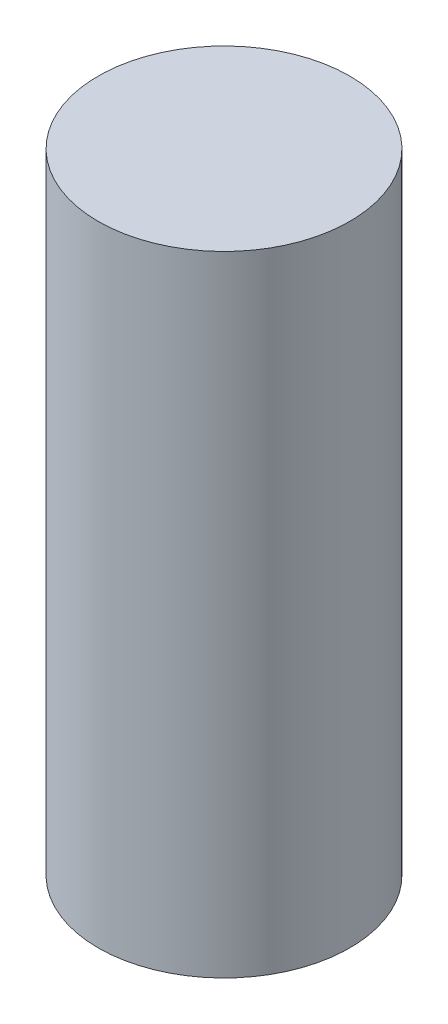
ISO-10303-21;
HEADER;
FILE_DESCRIPTION(('STEP AP214'),'2;1');
FILE_NAME('part.step','',(''),(''),'','','');
FILE_SCHEMA(('AUTOMOTIVE_DESIGN { 1 0 10303 214 1 1 1 1 }'));
ENDSEC;
DATA;
#1=APPLICATION_CONTEXT('core data for automotive mechanical design processes');
#2=APPLICATION_PROTOCOL_DEFINITION('international standard','automotive_design',2000,#1);
#3=PRODUCT_CONTEXT('',#1,'mechanical');
#4=PRODUCT('Part','Part','',(#3));
#5=PRODUCT_RELATED_PRODUCT_CATEGORY('part','',(#4));
#6=PRODUCT_DEFINITION_FORMATION('','',#4);
#7=PRODUCT_DEFINITION_CONTEXT('part definition',#1,'design');
#8=PRODUCT_DEFINITION('design','',#6,#7);
#9=PRODUCT_DEFINITION_SHAPE('','',#8);
#10=(LENGTH_UNIT() NAMED_UNIT(*) SI_UNIT(.MILLI.,.METRE.));
#11=(NAMED_UNIT(*) PLANE_ANGLE_UNIT() SI_UNIT($,.RADIAN.));
#12=(NAMED_UNIT(*) SI_UNIT($,.STERADIAN.) SOLID_ANGLE_UNIT());
#13=UNCERTAINTY_MEASURE_WITH_UNIT(LENGTH_MEASURE(1.E-05),#10,'distance_accuracy_value','');
#14=(GEOMETRIC_REPRESENTATION_CONTEXT(3) GLOBAL_UNCERTAINTY_ASSIGNED_CONTEXT((#13)) GLOBAL_UNIT_ASSIGNED_CONTEXT((#10,
#11,#12)) REPRESENTATION_CONTEXT('',''));
#15=CARTESIAN_POINT('',(0.,0.,0.));
#16=DIRECTION('',(0.,0.,1.));
#17=DIRECTION('',(1.,0.,0.));
#18=AXIS2_PLACEMENT_3D('',#15,#16,#17);
#19=CARTESIAN_POINT('',(0.,200.,0.));
#20=DIRECTION('',(0.,-1.,0.));
#21=DIRECTION('',(0.,0.,-1.));
#22=AXIS2_PLACEMENT_3D('',#19,#20,#21);
#23=CYLINDRICAL_SURFACE('',#22,40.);
#24=CARTESIAN_POINT('',(0.,200.,0.));
#25=DIRECTION('',(0.,1.,0.));
#26=DIRECTION('',(0.,0.,1.));
#27=AXIS2_PLACEMENT_3D('',#24,#25,#26);
#28=CIRCLE('',#27,40.);
#29=CARTESIAN_POINT('',(0.,200.,40.));
#30=VERTEX_POINT('',#29);
#31=EDGE_CURVE('E10',#30,#30,#28,.T.);
#32=ORIENTED_EDGE('',*,*,#31,.F.);
#33=EDGE_LOOP('',(#32));
#34=FACE_BOUND('',#33,.T.);
#35=CARTESIAN_POINT('',(0.,0.,0.));
#36=DIRECTION('',(0.,1.,0.));
#37=DIRECTION('',(0.,0.,1.));
#38=AXIS2_PLACEMENT_3D('',#35,#36,#37);
#39=CIRCLE('',#38,40.);
#40=CARTESIAN_POINT('',(0.,0.,40.));
#41=VERTEX_POINT('',#40);
#42=EDGE_CURVE('E38',#41,#41,#39,.T.);
#43=ORIENTED_EDGE('',*,*,#42,.T.);
#44=EDGE_LOOP('',(#43));
#45=FACE_BOUND('',#44,.T.);
#46=ADVANCED_FACE('F35',(#34,#45),#23,.T.);
#47=CARTESIAN_POINT('',(0.,200.,0.));
#48=DIRECTION('',(0.,1.,0.));
#49=DIRECTION('',(0.,0.,1.));
#50=AXIS2_PLACEMENT_3D('',#47,#48,#49);
#51=PLANE('',#50);
#52=ORIENTED_EDGE('',*,*,#31,.T.);
#53=EDGE_LOOP('',(#52));
#54=FACE_BOUND('',#53,.T.);
#55=ADVANCED_FACE('F50',(#54),#51,.T.);
#56=CARTESIAN_POINT('',(0.,0.,0.));
#57=DIRECTION('',(0.,1.,0.));
#58=DIRECTION('',(0.,0.,1.));
#59=AXIS2_PLACEMENT_3D('',#56,#57,#58);
#60=PLANE('',#59);
#61=ORIENTED_EDGE('',*,*,#42,.F.);
#62=EDGE_LOOP('',(#61));
#63=FACE_BOUND('',#62,.T.);
#64=ADVANCED_FACE('F48',(#63),#60,.F.);
#65=CLOSED_SHELL('',(#46,#55,#64));
#66=MANIFOLD_SOLID_BREP('B2',#65);
#67=ADVANCED_BREP_SHAPE_REPRESENTATION('',(#18,#66),#14);
#68=SHAPE_DEFINITION_REPRESENTATION(#9,#67);
ENDSEC;
END-ISO-10303-21;
